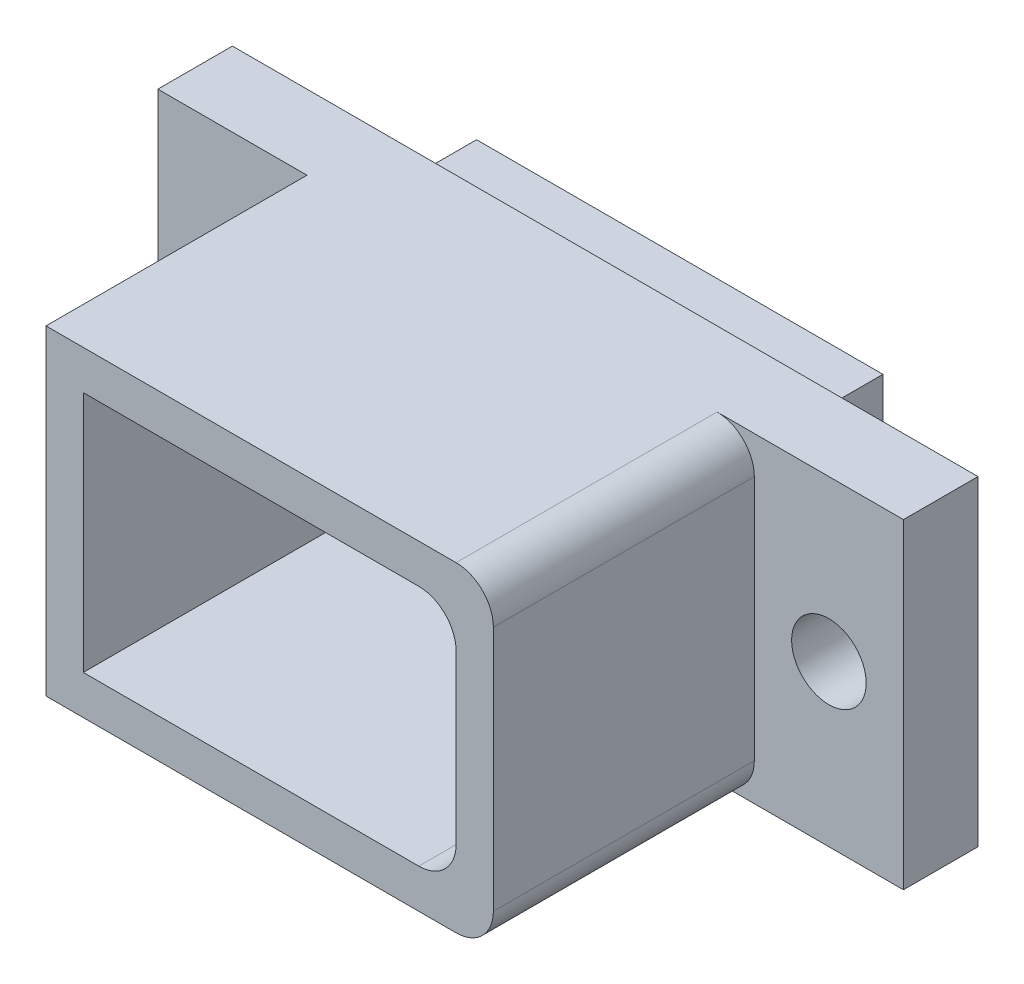
ISO-10303-21;
HEADER;
FILE_DESCRIPTION(('STEP AP214'),'2;1');
FILE_NAME('part.step','',(''),(''),'','','');
FILE_SCHEMA(('AUTOMOTIVE_DESIGN { 1 0 10303 214 1 1 1 1 }'));
ENDSEC;
DATA;
#1=APPLICATION_CONTEXT('core data for automotive mechanical design processes');
#2=APPLICATION_PROTOCOL_DEFINITION('international standard','automotive_design',2000,#1);
#3=PRODUCT_CONTEXT('',#1,'mechanical');
#4=PRODUCT('Part','Part','',(#3));
#5=PRODUCT_RELATED_PRODUCT_CATEGORY('part','',(#4));
#6=PRODUCT_DEFINITION_FORMATION('','',#4);
#7=PRODUCT_DEFINITION_CONTEXT('part definition',#1,'design');
#8=PRODUCT_DEFINITION('design','',#6,#7);
#9=PRODUCT_DEFINITION_SHAPE('','',#8);
#10=(LENGTH_UNIT() NAMED_UNIT(*) SI_UNIT(.MILLI.,.METRE.));
#11=(NAMED_UNIT(*) PLANE_ANGLE_UNIT() SI_UNIT($,.RADIAN.));
#12=(NAMED_UNIT(*) SI_UNIT($,.STERADIAN.) SOLID_ANGLE_UNIT());
#13=UNCERTAINTY_MEASURE_WITH_UNIT(LENGTH_MEASURE(1.E-05),#10,'distance_accuracy_value','');
#14=(GEOMETRIC_REPRESENTATION_CONTEXT(3) GLOBAL_UNCERTAINTY_ASSIGNED_CONTEXT((#13)) GLOBAL_UNIT_ASSIGNED_CONTEXT((#10,
#11,#12)) REPRESENTATION_CONTEXT('',''));
#15=CARTESIAN_POINT('',(0.,0.,0.));
#16=DIRECTION('',(0.,0.,1.));
#17=DIRECTION('',(1.,0.,0.));
#18=AXIS2_PLACEMENT_3D('',#15,#16,#17);
#19=CARTESIAN_POINT('',(0.,0.,4.));
#20=DIRECTION('',(0.,0.,1.));
#21=DIRECTION('',(1.,0.,0.));
#22=AXIS2_PLACEMENT_3D('',#19,#20,#21);
#23=PLANE('',#22);
#24=CARTESIAN_POINT('',(-8.,0.,4.));
#25=DIRECTION('',(0.,0.,1.));
#26=DIRECTION('',(1.,0.,0.));
#27=AXIS2_PLACEMENT_3D('',#24,#25,#26);
#28=CIRCLE('',#27,1.);
#29=CARTESIAN_POINT('',(-7.,0.,4.));
#30=VERTEX_POINT('',#29);
#31=EDGE_CURVE('E301',#30,#30,#28,.T.);
#32=ORIENTED_EDGE('',*,*,#31,.F.);
#33=EDGE_LOOP('',(#32));
#34=FACE_BOUND('',#33,.T.);
#35=DIRECTION('',(0.,-1.,0.));
#36=VECTOR('',#35,1.);
#37=CARTESIAN_POINT('',(-6.,0.,4.));
#38=LINE('',#37,#36);
#39=CARTESIAN_POINT('',(-6.,4.3,4.));
#40=VERTEX_POINT('',#39);
#41=CARTESIAN_POINT('',(-6.,-4.3,4.));
#42=VERTEX_POINT('',#41);
#43=EDGE_CURVE('E230',#40,#42,#38,.T.);
#44=ORIENTED_EDGE('',*,*,#43,.F.);
#45=DIRECTION('',(-1.,0.,0.));
#46=VECTOR('',#45,1.);
#47=CARTESIAN_POINT('',(-10.,4.3,4.));
#48=LINE('',#47,#46);
#49=CARTESIAN_POINT('',(-10.,4.3,4.));
#50=VERTEX_POINT('',#49);
#51=EDGE_CURVE('E310',#40,#50,#48,.T.);
#52=ORIENTED_EDGE('',*,*,#51,.T.);
#53=DIRECTION('',(0.,-1.,0.));
#54=VECTOR('',#53,1.);
#55=CARTESIAN_POINT('',(-10.,4.3,4.));
#56=LINE('',#55,#54);
#57=CARTESIAN_POINT('',(-10.,-4.3,4.));
#58=VERTEX_POINT('',#57);
#59=EDGE_CURVE('E314',#50,#58,#56,.T.);
#60=ORIENTED_EDGE('',*,*,#59,.T.);
#61=DIRECTION('',(1.,0.,0.));
#62=VECTOR('',#61,1.);
#63=CARTESIAN_POINT('',(-10.,-4.3,4.));
#64=LINE('',#63,#62);
#65=EDGE_CURVE('E317',#58,#42,#64,.T.);
#66=ORIENTED_EDGE('',*,*,#65,.T.);
#67=EDGE_LOOP('',(#44,#52,#60,#66));
#68=FACE_BOUND('',#67,.T.);
#69=ADVANCED_FACE('F42',(#34,#68),#23,.T.);
#70=CARTESIAN_POINT('',(-3.,1.5,4.));
#71=DIRECTION('',(0.,0.,1.));
#72=DIRECTION('',(1.,0.,0.));
#73=AXIS2_PLACEMENT_3D('',#70,#71,#72);
#74=CIRCLE('',#73,0.5);
#75=CARTESIAN_POINT('',(-2.5,1.5,4.));
#76=VERTEX_POINT('',#75);
#77=EDGE_CURVE('E266',#76,#76,#74,.T.);
#78=ORIENTED_EDGE('',*,*,#77,.F.);
#79=EDGE_LOOP('',(#78));
#80=FACE_BOUND('',#79,.T.);
#81=CARTESIAN_POINT('',(0.,1.5,4.));
#82=DIRECTION('',(0.,0.,1.));
#83=DIRECTION('',(1.,0.,0.));
#84=AXIS2_PLACEMENT_3D('',#81,#82,#83);
#85=CIRCLE('',#84,0.5);
#86=CARTESIAN_POINT('',(0.500000000000001,1.5,4.));
#87=VERTEX_POINT('',#86);
#88=EDGE_CURVE('E282',#87,#87,#85,.T.);
#89=ORIENTED_EDGE('',*,*,#88,.F.);
#90=EDGE_LOOP('',(#89));
#91=FACE_BOUND('',#90,.T.);
#92=CARTESIAN_POINT('',(3.00000000000003,-1.5,4.));
#93=DIRECTION('',(0.,0.,1.));
#94=DIRECTION('',(1.,0.,0.));
#95=AXIS2_PLACEMENT_3D('',#92,#93,#94);
#96=CIRCLE('',#95,0.5);
#97=CARTESIAN_POINT('',(3.50000000000003,-1.5,4.));
#98=VERTEX_POINT('',#97);
#99=EDGE_CURVE('E288',#98,#98,#96,.T.);
#100=ORIENTED_EDGE('',*,*,#99,.F.);
#101=EDGE_LOOP('',(#100));
#102=FACE_BOUND('',#101,.T.);
#103=CARTESIAN_POINT('',(3.,1.5,4.));
#104=DIRECTION('',(0.,0.,1.));
#105=DIRECTION('',(1.,0.,0.));
#106=AXIS2_PLACEMENT_3D('',#103,#104,#105);
#107=CIRCLE('',#106,0.5);
#108=CARTESIAN_POINT('',(3.5,1.5,4.));
#109=VERTEX_POINT('',#108);
#110=EDGE_CURVE('E291',#109,#109,#107,.T.);
#111=ORIENTED_EDGE('',*,*,#110,.F.);
#112=EDGE_LOOP('',(#111));
#113=FACE_BOUND('',#112,.T.);
#114=CARTESIAN_POINT('',(0.,-1.5,4.));
#115=DIRECTION('',(0.,0.,1.));
#116=DIRECTION('',(1.,0.,0.));
#117=AXIS2_PLACEMENT_3D('',#114,#115,#116);
#118=CIRCLE('',#117,0.5);
#119=CARTESIAN_POINT('',(0.500000000000032,-1.5,4.));
#120=VERTEX_POINT('',#119);
#121=EDGE_CURVE('E285',#120,#120,#118,.T.);
#122=ORIENTED_EDGE('',*,*,#121,.F.);
#123=EDGE_LOOP('',(#122));
#124=FACE_BOUND('',#123,.T.);
#125=CARTESIAN_POINT('',(-2.99999999999997,-1.5,4.));
#126=DIRECTION('',(0.,0.,1.));
#127=DIRECTION('',(1.,0.,0.));
#128=AXIS2_PLACEMENT_3D('',#125,#126,#127);
#129=CIRCLE('',#128,0.5);
#130=CARTESIAN_POINT('',(-2.49999999999997,-1.5,4.));
#131=VERTEX_POINT('',#130);
#132=EDGE_CURVE('E279',#131,#131,#129,.T.);
#133=ORIENTED_EDGE('',*,*,#132,.F.);
#134=EDGE_LOOP('',(#133));
#135=FACE_BOUND('',#134,.T.);
#136=DIRECTION('',(1.,0.,0.));
#137=VECTOR('',#136,1.);
#138=CARTESIAN_POINT('',(0.,3.25,4.));
#139=LINE('',#138,#137);
#140=CARTESIAN_POINT('',(-5.,3.25,4.));
#141=VERTEX_POINT('',#140);
#142=CARTESIAN_POINT('',(3.99999999999999,3.25,4.));
#143=VERTEX_POINT('',#142);
#144=EDGE_CURVE('E237',#141,#143,#139,.T.);
#145=ORIENTED_EDGE('',*,*,#144,.F.);
#146=DIRECTION('',(0.,-1.,0.));
#147=VECTOR('',#146,1.);
#148=CARTESIAN_POINT('',(-5.,0.,4.));
#149=LINE('',#148,#147);
#150=CARTESIAN_POINT('',(-5.,-3.25,4.));
#151=VERTEX_POINT('',#150);
#152=EDGE_CURVE('E201',#141,#151,#149,.T.);
#153=ORIENTED_EDGE('',*,*,#152,.T.);
#154=DIRECTION('',(1.,0.,0.));
#155=VECTOR('',#154,1.);
#156=CARTESIAN_POINT('',(0.,-3.25,4.));
#157=LINE('',#156,#155);
#158=CARTESIAN_POINT('',(4.,-3.25,4.));
#159=VERTEX_POINT('',#158);
#160=EDGE_CURVE('E203',#151,#159,#157,.T.);
#161=ORIENTED_EDGE('',*,*,#160,.T.);
#162=CARTESIAN_POINT('',(4.,-2.25,4.));
#163=DIRECTION('',(0.,0.,1.));
#164=DIRECTION('',(1.,0.,0.));
#165=AXIS2_PLACEMENT_3D('',#162,#163,#164);
#166=CIRCLE('',#165,1.);
#167=CARTESIAN_POINT('',(5.,-2.24999999999999,4.));
#168=VERTEX_POINT('',#167);
#169=EDGE_CURVE('E246',#159,#168,#166,.T.);
#170=ORIENTED_EDGE('',*,*,#169,.T.);
#171=DIRECTION('',(0.,-1.,0.));
#172=VECTOR('',#171,1.);
#173=CARTESIAN_POINT('',(5.,0.,4.));
#174=LINE('',#173,#172);
#175=CARTESIAN_POINT('',(5.,2.24999999999999,4.));
#176=VERTEX_POINT('',#175);
#177=EDGE_CURVE('E243',#176,#168,#174,.T.);
#178=ORIENTED_EDGE('',*,*,#177,.F.);
#179=CARTESIAN_POINT('',(4.,2.25,4.));
#180=DIRECTION('',(0.,0.,1.));
#181=DIRECTION('',(1.,0.,0.));
#182=AXIS2_PLACEMENT_3D('',#179,#180,#181);
#183=CIRCLE('',#182,0.999999999999999);
#184=EDGE_CURVE('E240',#143,#176,#183,.F.);
#185=ORIENTED_EDGE('',*,*,#184,.F.);
#186=EDGE_LOOP('',(#145,#153,#161,#170,#178,#185));
#187=FACE_BOUND('',#186,.T.);
#188=ADVANCED_FACE('F409',(#80,#91,#102,#113,#124,#135,#187),#23,.T.);
#189=CARTESIAN_POINT('',(0.,0.,0.));
#190=DIRECTION('',(0.,0.,1.));
#191=DIRECTION('',(1.,0.,0.));
#192=AXIS2_PLACEMENT_3D('',#189,#190,#191);
#193=PLANE('',#192);
#194=DIRECTION('',(0.,1.,0.));
#195=VECTOR('',#194,1.);
#196=CARTESIAN_POINT('',(5.45,3.4,0.));
#197=LINE('',#196,#195);
#198=CARTESIAN_POINT('',(5.45,-3.4,0.));
#199=VERTEX_POINT('',#198);
#200=CARTESIAN_POINT('',(5.45,3.4,0.));
#201=VERTEX_POINT('',#200);
#202=EDGE_CURVE('E356',#199,#201,#197,.T.);
#203=ORIENTED_EDGE('',*,*,#202,.F.);
#204=DIRECTION('',(1.,0.,0.));
#205=VECTOR('',#204,1.);
#206=CARTESIAN_POINT('',(-5.45,-3.4,0.));
#207=LINE('',#206,#205);
#208=CARTESIAN_POINT('',(-5.45,-3.4,0.));
#209=VERTEX_POINT('',#208);
#210=EDGE_CURVE('E361',#209,#199,#207,.T.);
#211=ORIENTED_EDGE('',*,*,#210,.F.);
#212=DIRECTION('',(0.,-1.,0.));
#213=VECTOR('',#212,1.);
#214=CARTESIAN_POINT('',(-5.45,3.4,0.));
#215=LINE('',#214,#213);
#216=CARTESIAN_POINT('',(-5.45,3.4,0.));
#217=VERTEX_POINT('',#216);
#218=EDGE_CURVE('E375',#217,#209,#215,.T.);
#219=ORIENTED_EDGE('',*,*,#218,.F.);
#220=DIRECTION('',(-1.,0.,0.));
#221=VECTOR('',#220,1.);
#222=CARTESIAN_POINT('',(-5.45,3.4,0.));
#223=LINE('',#222,#221);
#224=EDGE_CURVE('E373',#201,#217,#223,.T.);
#225=ORIENTED_EDGE('',*,*,#224,.F.);
#226=EDGE_LOOP('',(#203,#211,#219,#225));
#227=FACE_BOUND('',#226,.T.);
#228=CARTESIAN_POINT('',(-3.,1.5,0.));
#229=DIRECTION('',(0.,0.,1.));
#230=DIRECTION('',(1.,0.,0.));
#231=AXIS2_PLACEMENT_3D('',#228,#229,#230);
#232=CIRCLE('',#231,0.5);
#233=CARTESIAN_POINT('',(-2.5,1.5,0.));
#234=VERTEX_POINT('',#233);
#235=EDGE_CURVE('E353',#234,#234,#232,.T.);
#236=ORIENTED_EDGE('',*,*,#235,.T.);
#237=EDGE_LOOP('',(#236));
#238=FACE_BOUND('',#237,.T.);
#239=CARTESIAN_POINT('',(0.,1.5,0.));
#240=DIRECTION('',(0.,0.,1.));
#241=DIRECTION('',(1.,0.,0.));
#242=AXIS2_PLACEMENT_3D('',#239,#240,#241);
#243=CIRCLE('',#242,0.5);
#244=CARTESIAN_POINT('',(0.500000000000001,1.5,0.));
#245=VERTEX_POINT('',#244);
#246=EDGE_CURVE('E350',#245,#245,#243,.T.);
#247=ORIENTED_EDGE('',*,*,#246,.T.);
#248=EDGE_LOOP('',(#247));
#249=FACE_BOUND('',#248,.T.);
#250=CARTESIAN_POINT('',(3.,1.5,0.));
#251=DIRECTION('',(0.,0.,1.));
#252=DIRECTION('',(1.,0.,0.));
#253=AXIS2_PLACEMENT_3D('',#250,#251,#252);
#254=CIRCLE('',#253,0.5);
#255=CARTESIAN_POINT('',(3.5,1.5,0.));
#256=VERTEX_POINT('',#255);
#257=EDGE_CURVE('E347',#256,#256,#254,.T.);
#258=ORIENTED_EDGE('',*,*,#257,.T.);
#259=EDGE_LOOP('',(#258));
#260=FACE_BOUND('',#259,.T.);
#261=CARTESIAN_POINT('',(0.,-1.5,0.));
#262=DIRECTION('',(0.,0.,1.));
#263=DIRECTION('',(1.,0.,0.));
#264=AXIS2_PLACEMENT_3D('',#261,#262,#263);
#265=CIRCLE('',#264,0.5);
#266=CARTESIAN_POINT('',(0.500000000000032,-1.5,0.));
#267=VERTEX_POINT('',#266);
#268=EDGE_CURVE('E344',#267,#267,#265,.T.);
#269=ORIENTED_EDGE('',*,*,#268,.T.);
#270=EDGE_LOOP('',(#269));
#271=FACE_BOUND('',#270,.T.);
#272=CARTESIAN_POINT('',(3.00000000000003,-1.5,0.));
#273=DIRECTION('',(0.,0.,1.));
#274=DIRECTION('',(1.,0.,0.));
#275=AXIS2_PLACEMENT_3D('',#272,#273,#274);
#276=CIRCLE('',#275,0.5);
#277=CARTESIAN_POINT('',(3.50000000000003,-1.5,0.));
#278=VERTEX_POINT('',#277);
#279=EDGE_CURVE('E341',#278,#278,#276,.T.);
#280=ORIENTED_EDGE('',*,*,#279,.T.);
#281=EDGE_LOOP('',(#280));
#282=FACE_BOUND('',#281,.T.);
#283=CARTESIAN_POINT('',(-2.99999999999997,-1.5,0.));
#284=DIRECTION('',(0.,0.,1.));
#285=DIRECTION('',(1.,0.,0.));
#286=AXIS2_PLACEMENT_3D('',#283,#284,#285);
#287=CIRCLE('',#286,0.5);
#288=CARTESIAN_POINT('',(-2.49999999999997,-1.5,0.));
#289=VERTEX_POINT('',#288);
#290=EDGE_CURVE('E338',#289,#289,#287,.T.);
#291=ORIENTED_EDGE('',*,*,#290,.T.);
#292=EDGE_LOOP('',(#291));
#293=FACE_BOUND('',#292,.T.);
#294=ADVANCED_FACE('F391',(#227,#238,#249,#260,#271,#282,#293),#193,.F.);
#295=CARTESIAN_POINT('',(5.45,3.4,2.));
#296=DIRECTION('',(-1.,0.,0.));
#297=DIRECTION('',(0.,-1.,0.));
#298=AXIS2_PLACEMENT_3D('',#295,#296,#297);
#299=PLANE('',#298);
#300=ORIENTED_EDGE('',*,*,#202,.T.);
#301=DIRECTION('',(0.,0.,-1.));
#302=VECTOR('',#301,1.);
#303=CARTESIAN_POINT('',(5.45,3.4,2.));
#304=LINE('',#303,#302);
#305=CARTESIAN_POINT('',(5.45,3.4,2.));
#306=VERTEX_POINT('',#305);
#307=EDGE_CURVE('E11',#306,#201,#304,.T.);
#308=ORIENTED_EDGE('',*,*,#307,.F.);
#309=DIRECTION('',(0.,1.,0.));
#310=VECTOR('',#309,1.);
#311=CARTESIAN_POINT('',(5.45,3.4,2.));
#312=LINE('',#311,#310);
#313=CARTESIAN_POINT('',(5.45,-3.4,2.));
#314=VERTEX_POINT('',#313);
#315=EDGE_CURVE('E357',#314,#306,#312,.T.);
#316=ORIENTED_EDGE('',*,*,#315,.F.);
#317=DIRECTION('',(0.,0.,-1.));
#318=VECTOR('',#317,1.);
#319=CARTESIAN_POINT('',(5.45,-3.4,2.));
#320=LINE('',#319,#318);
#321=EDGE_CURVE('E370',#314,#199,#320,.T.);
#322=ORIENTED_EDGE('',*,*,#321,.T.);
#323=EDGE_LOOP('',(#300,#308,#316,#322));
#324=FACE_BOUND('',#323,.T.);
#325=ADVANCED_FACE('F44',(#324),#299,.F.);
#326=CARTESIAN_POINT('',(-5.45,3.4,2.));
#327=DIRECTION('',(0.,-1.,0.));
#328=DIRECTION('',(0.,0.,-1.));
#329=AXIS2_PLACEMENT_3D('',#326,#327,#328);
#330=PLANE('',#329);
#331=ORIENTED_EDGE('',*,*,#224,.T.);
#332=DIRECTION('',(0.,0.,-1.));
#333=VECTOR('',#332,1.);
#334=CARTESIAN_POINT('',(-5.45,3.4,2.));
#335=LINE('',#334,#333);
#336=CARTESIAN_POINT('',(-5.45,3.4,2.));
#337=VERTEX_POINT('',#336);
#338=EDGE_CURVE('E50',#337,#217,#335,.T.);
#339=ORIENTED_EDGE('',*,*,#338,.F.);
#340=DIRECTION('',(-1.,0.,0.));
#341=VECTOR('',#340,1.);
#342=CARTESIAN_POINT('',(-5.45,3.4,2.));
#343=LINE('',#342,#341);
#344=EDGE_CURVE('E360',#306,#337,#343,.T.);
#345=ORIENTED_EDGE('',*,*,#344,.F.);
#346=ORIENTED_EDGE('',*,*,#307,.T.);
#347=EDGE_LOOP('',(#331,#339,#345,#346));
#348=FACE_BOUND('',#347,.T.);
#349=ADVANCED_FACE('F401',(#348),#330,.F.);
#350=CARTESIAN_POINT('',(-5.45,3.4,2.));
#351=DIRECTION('',(1.,0.,0.));
#352=DIRECTION('',(0.,1.,0.));
#353=AXIS2_PLACEMENT_3D('',#350,#351,#352);
#354=PLANE('',#353);
#355=ORIENTED_EDGE('',*,*,#218,.T.);
#356=DIRECTION('',(0.,0.,-1.));
#357=VECTOR('',#356,1.);
#358=CARTESIAN_POINT('',(-5.45,-3.4,2.));
#359=LINE('',#358,#357);
#360=CARTESIAN_POINT('',(-5.45,-3.4,2.));
#361=VERTEX_POINT('',#360);
#362=EDGE_CURVE('E380',#361,#209,#359,.T.);
#363=ORIENTED_EDGE('',*,*,#362,.F.);
#364=DIRECTION('',(0.,-1.,0.));
#365=VECTOR('',#364,1.);
#366=CARTESIAN_POINT('',(-5.45,3.4,2.));
#367=LINE('',#366,#365);
#368=EDGE_CURVE('E364',#337,#361,#367,.T.);
#369=ORIENTED_EDGE('',*,*,#368,.F.);
#370=ORIENTED_EDGE('',*,*,#338,.T.);
#371=EDGE_LOOP('',(#355,#363,#369,#370));
#372=FACE_BOUND('',#371,.T.);
#373=ADVANCED_FACE('F386',(#372),#354,.F.);
#374=CARTESIAN_POINT('',(-5.45,-3.4,2.));
#375=DIRECTION('',(0.,1.,0.));
#376=DIRECTION('',(0.,0.,1.));
#377=AXIS2_PLACEMENT_3D('',#374,#375,#376);
#378=PLANE('',#377);
#379=ORIENTED_EDGE('',*,*,#210,.T.);
#380=ORIENTED_EDGE('',*,*,#321,.F.);
#381=DIRECTION('',(1.,0.,0.));
#382=VECTOR('',#381,1.);
#383=CARTESIAN_POINT('',(-5.45,-3.4,2.));
#384=LINE('',#383,#382);
#385=EDGE_CURVE('E367',#361,#314,#384,.T.);
#386=ORIENTED_EDGE('',*,*,#385,.F.);
#387=ORIENTED_EDGE('',*,*,#362,.T.);
#388=EDGE_LOOP('',(#379,#380,#386,#387));
#389=FACE_BOUND('',#388,.T.);
#390=ADVANCED_FACE('F395',(#389),#378,.F.);
#391=CARTESIAN_POINT('',(-3.,1.5,2.));
#392=DIRECTION('',(0.,0.,-1.));
#393=DIRECTION('',(-1.,0.,0.));
#394=AXIS2_PLACEMENT_3D('',#391,#392,#393);
#395=CYLINDRICAL_SURFACE('',#394,0.5);
#396=ORIENTED_EDGE('',*,*,#235,.F.);
#397=EDGE_LOOP('',(#396));
#398=FACE_BOUND('',#397,.T.);
#399=ORIENTED_EDGE('',*,*,#77,.T.);
#400=EDGE_LOOP('',(#399));
#401=FACE_BOUND('',#400,.T.);
#402=ADVANCED_FACE('F512',(#398,#401),#395,.F.);
#403=CARTESIAN_POINT('',(0.,1.5,2.));
#404=DIRECTION('',(0.,0.,-1.));
#405=DIRECTION('',(-1.,0.,0.));
#406=AXIS2_PLACEMENT_3D('',#403,#404,#405);
#407=CYLINDRICAL_SURFACE('',#406,0.5);
#408=ORIENTED_EDGE('',*,*,#246,.F.);
#409=EDGE_LOOP('',(#408));
#410=FACE_BOUND('',#409,.T.);
#411=ORIENTED_EDGE('',*,*,#88,.T.);
#412=EDGE_LOOP('',(#411));
#413=FACE_BOUND('',#412,.T.);
#414=ADVANCED_FACE('F508',(#410,#413),#407,.F.);
#415=CARTESIAN_POINT('',(3.,1.5,2.));
#416=DIRECTION('',(0.,0.,-1.));
#417=DIRECTION('',(-1.,0.,0.));
#418=AXIS2_PLACEMENT_3D('',#415,#416,#417);
#419=CYLINDRICAL_SURFACE('',#418,0.5);
#420=ORIENTED_EDGE('',*,*,#257,.F.);
#421=EDGE_LOOP('',(#420));
#422=FACE_BOUND('',#421,.T.);
#423=ORIENTED_EDGE('',*,*,#110,.T.);
#424=EDGE_LOOP('',(#423));
#425=FACE_BOUND('',#424,.T.);
#426=ADVANCED_FACE('F504',(#422,#425),#419,.F.);
#427=CARTESIAN_POINT('',(0.,-1.5,2.));
#428=DIRECTION('',(0.,0.,-1.));
#429=DIRECTION('',(-1.,0.,0.));
#430=AXIS2_PLACEMENT_3D('',#427,#428,#429);
#431=CYLINDRICAL_SURFACE('',#430,0.5);
#432=ORIENTED_EDGE('',*,*,#268,.F.);
#433=EDGE_LOOP('',(#432));
#434=FACE_BOUND('',#433,.T.);
#435=ORIENTED_EDGE('',*,*,#121,.T.);
#436=EDGE_LOOP('',(#435));
#437=FACE_BOUND('',#436,.T.);
#438=ADVANCED_FACE('F500',(#434,#437),#431,.F.);
#439=CARTESIAN_POINT('',(3.00000000000003,-1.5,2.));
#440=DIRECTION('',(0.,0.,-1.));
#441=DIRECTION('',(-1.,0.,0.));
#442=AXIS2_PLACEMENT_3D('',#439,#440,#441);
#443=CYLINDRICAL_SURFACE('',#442,0.5);
#444=ORIENTED_EDGE('',*,*,#279,.F.);
#445=EDGE_LOOP('',(#444));
#446=FACE_BOUND('',#445,.T.);
#447=ORIENTED_EDGE('',*,*,#99,.T.);
#448=EDGE_LOOP('',(#447));
#449=FACE_BOUND('',#448,.T.);
#450=ADVANCED_FACE('F496',(#446,#449),#443,.F.);
#451=CARTESIAN_POINT('',(-2.99999999999997,-1.5,2.));
#452=DIRECTION('',(0.,0.,-1.));
#453=DIRECTION('',(-1.,0.,0.));
#454=AXIS2_PLACEMENT_3D('',#451,#452,#453);
#455=CYLINDRICAL_SURFACE('',#454,0.5);
#456=ORIENTED_EDGE('',*,*,#290,.F.);
#457=EDGE_LOOP('',(#456));
#458=FACE_BOUND('',#457,.T.);
#459=ORIENTED_EDGE('',*,*,#132,.T.);
#460=EDGE_LOOP('',(#459));
#461=FACE_BOUND('',#460,.T.);
#462=ADVANCED_FACE('F431',(#458,#461),#455,.F.);
#463=CARTESIAN_POINT('',(0.,0.,2.));
#464=DIRECTION('',(0.,0.,1.));
#465=DIRECTION('',(1.,0.,0.));
#466=AXIS2_PLACEMENT_3D('',#463,#464,#465);
#467=PLANE('',#466);
#468=CARTESIAN_POINT('',(7.99999999999999,0.,2.));
#469=DIRECTION('',(0.,0.,1.));
#470=DIRECTION('',(-1.,0.,0.));
#471=AXIS2_PLACEMENT_3D('',#468,#469,#470);
#472=CIRCLE('',#471,1.);
#473=CARTESIAN_POINT('',(6.99999999999999,0.,2.));
#474=VERTEX_POINT('',#473);
#475=EDGE_CURVE('E294',#474,#474,#472,.T.);
#476=ORIENTED_EDGE('',*,*,#475,.T.);
#477=EDGE_LOOP('',(#476));
#478=FACE_BOUND('',#477,.T.);
#479=CARTESIAN_POINT('',(-8.,0.,2.));
#480=DIRECTION('',(0.,0.,1.));
#481=DIRECTION('',(1.,0.,0.));
#482=AXIS2_PLACEMENT_3D('',#479,#480,#481);
#483=CIRCLE('',#482,1.);
#484=CARTESIAN_POINT('',(-7.,0.,2.));
#485=VERTEX_POINT('',#484);
#486=EDGE_CURVE('E298',#485,#485,#483,.T.);
#487=ORIENTED_EDGE('',*,*,#486,.T.);
#488=EDGE_LOOP('',(#487));
#489=FACE_BOUND('',#488,.T.);
#490=DIRECTION('',(0.,1.,0.));
#491=VECTOR('',#490,1.);
#492=CARTESIAN_POINT('',(10.,4.3,2.));
#493=LINE('',#492,#491);
#494=CARTESIAN_POINT('',(10.,-4.3,2.));
#495=VERTEX_POINT('',#494);
#496=CARTESIAN_POINT('',(10.,4.3,2.));
#497=VERTEX_POINT('',#496);
#498=EDGE_CURVE('E304',#495,#497,#493,.T.);
#499=ORIENTED_EDGE('',*,*,#498,.F.);
#500=DIRECTION('',(1.,0.,0.));
#501=VECTOR('',#500,1.);
#502=CARTESIAN_POINT('',(-10.,-4.3,2.));
#503=LINE('',#502,#501);
#504=CARTESIAN_POINT('',(-10.,-4.3,2.));
#505=VERTEX_POINT('',#504);
#506=EDGE_CURVE('E311',#505,#495,#503,.T.);
#507=ORIENTED_EDGE('',*,*,#506,.F.);
#508=DIRECTION('',(0.,-1.,0.));
#509=VECTOR('',#508,1.);
#510=CARTESIAN_POINT('',(-10.,4.3,2.));
#511=LINE('',#510,#509);
#512=CARTESIAN_POINT('',(-10.,4.3,2.));
#513=VERTEX_POINT('',#512);
#514=EDGE_CURVE('E324',#513,#505,#511,.T.);
#515=ORIENTED_EDGE('',*,*,#514,.F.);
#516=DIRECTION('',(-1.,0.,0.));
#517=VECTOR('',#516,1.);
#518=CARTESIAN_POINT('',(-10.,4.3,2.));
#519=LINE('',#518,#517);
#520=EDGE_CURVE('E322',#497,#513,#519,.T.);
#521=ORIENTED_EDGE('',*,*,#520,.F.);
#522=EDGE_LOOP('',(#499,#507,#515,#521));
#523=FACE_BOUND('',#522,.T.);
#524=ORIENTED_EDGE('',*,*,#385,.T.);
#525=ORIENTED_EDGE('',*,*,#315,.T.);
#526=ORIENTED_EDGE('',*,*,#344,.T.);
#527=ORIENTED_EDGE('',*,*,#368,.T.);
#528=EDGE_LOOP('',(#524,#525,#526,#527));
#529=FACE_BOUND('',#528,.T.);
#530=ADVANCED_FACE('F400',(#478,#489,#523,#529),#467,.F.);
#531=CARTESIAN_POINT('',(10.,4.3,4.));
#532=VERTEX_POINT('',#531);
#533=CARTESIAN_POINT('',(5.,4.3,4.));
#534=VERTEX_POINT('',#533);
#535=EDGE_CURVE('E312',#532,#534,#48,.T.);
#536=ORIENTED_EDGE('',*,*,#535,.T.);
#537=CARTESIAN_POINT('',(5.,3.3,4.));
#538=DIRECTION('',(0.,0.,1.));
#539=DIRECTION('',(1.,0.,0.));
#540=AXIS2_PLACEMENT_3D('',#537,#538,#539);
#541=CIRCLE('',#540,1.);
#542=CARTESIAN_POINT('',(6.,3.29999999999999,4.));
#543=VERTEX_POINT('',#542);
#544=EDGE_CURVE('E57',#534,#543,#541,.F.);
#545=ORIENTED_EDGE('',*,*,#544,.T.);
#546=DIRECTION('',(0.,-1.,0.));
#547=VECTOR('',#546,1.);
#548=CARTESIAN_POINT('',(6.,0.,4.));
#549=LINE('',#548,#547);
#550=CARTESIAN_POINT('',(6.,-3.29999999999999,4.));
#551=VERTEX_POINT('',#550);
#552=EDGE_CURVE('E62',#543,#551,#549,.T.);
#553=ORIENTED_EDGE('',*,*,#552,.T.);
#554=CARTESIAN_POINT('',(5.,-3.3,4.));
#555=DIRECTION('',(0.,0.,1.));
#556=DIRECTION('',(1.,0.,0.));
#557=AXIS2_PLACEMENT_3D('',#554,#555,#556);
#558=CIRCLE('',#557,1.);
#559=CARTESIAN_POINT('',(5.,-4.3,4.));
#560=VERTEX_POINT('',#559);
#561=EDGE_CURVE('E233',#560,#551,#558,.T.);
#562=ORIENTED_EDGE('',*,*,#561,.F.);
#563=CARTESIAN_POINT('',(10.,-4.3,4.));
#564=VERTEX_POINT('',#563);
#565=EDGE_CURVE('E316',#560,#564,#64,.T.);
#566=ORIENTED_EDGE('',*,*,#565,.T.);
#567=DIRECTION('',(0.,1.,0.));
#568=VECTOR('',#567,1.);
#569=CARTESIAN_POINT('',(10.,4.3,4.));
#570=LINE('',#569,#568);
#571=EDGE_CURVE('E307',#564,#532,#570,.T.);
#572=ORIENTED_EDGE('',*,*,#571,.T.);
#573=EDGE_LOOP('',(#536,#545,#553,#562,#566,#572));
#574=FACE_BOUND('',#573,.T.);
#575=CARTESIAN_POINT('',(7.99999999999999,0.,4.));
#576=DIRECTION('',(0.,0.,1.));
#577=DIRECTION('',(-1.,0.,0.));
#578=AXIS2_PLACEMENT_3D('',#575,#576,#577);
#579=CIRCLE('',#578,1.);
#580=CARTESIAN_POINT('',(6.99999999999999,0.,4.));
#581=VERTEX_POINT('',#580);
#582=EDGE_CURVE('E295',#581,#581,#579,.T.);
#583=ORIENTED_EDGE('',*,*,#582,.F.);
#584=EDGE_LOOP('',(#583));
#585=FACE_BOUND('',#584,.T.);
#586=ADVANCED_FACE('F412',(#574,#585),#23,.T.);
#587=CARTESIAN_POINT('',(10.,4.3,4.));
#588=DIRECTION('',(-1.,0.,0.));
#589=DIRECTION('',(0.,0.,1.));
#590=AXIS2_PLACEMENT_3D('',#587,#588,#589);
#591=PLANE('',#590);
#592=ORIENTED_EDGE('',*,*,#498,.T.);
#593=DIRECTION('',(0.,0.,-1.));
#594=VECTOR('',#593,1.);
#595=CARTESIAN_POINT('',(10.,4.3,4.));
#596=LINE('',#595,#594);
#597=EDGE_CURVE('E335',#532,#497,#596,.T.);
#598=ORIENTED_EDGE('',*,*,#597,.F.);
#599=ORIENTED_EDGE('',*,*,#571,.F.);
#600=DIRECTION('',(0.,0.,-1.));
#601=VECTOR('',#600,1.);
#602=CARTESIAN_POINT('',(10.,-4.3,4.));
#603=LINE('',#602,#601);
#604=EDGE_CURVE('E319',#564,#495,#603,.T.);
#605=ORIENTED_EDGE('',*,*,#604,.T.);
#606=EDGE_LOOP('',(#592,#598,#599,#605));
#607=FACE_BOUND('',#606,.T.);
#608=ADVANCED_FACE('F423',(#607),#591,.F.);
#609=CARTESIAN_POINT('',(-10.,4.3,4.));
#610=DIRECTION('',(0.,-1.,0.));
#611=DIRECTION('',(0.,0.,-1.));
#612=AXIS2_PLACEMENT_3D('',#609,#610,#611);
#613=PLANE('',#612);
#614=ORIENTED_EDGE('',*,*,#520,.T.);
#615=DIRECTION('',(0.,0.,-1.));
#616=VECTOR('',#615,1.);
#617=CARTESIAN_POINT('',(-10.,4.3,4.));
#618=LINE('',#617,#616);
#619=EDGE_CURVE('E332',#50,#513,#618,.T.);
#620=ORIENTED_EDGE('',*,*,#619,.F.);
#621=ORIENTED_EDGE('',*,*,#51,.F.);
#622=DIRECTION('',(0.,0.,-1.));
#623=VECTOR('',#622,1.);
#624=CARTESIAN_POINT('',(-6.,4.3,11.));
#625=LINE('',#624,#623);
#626=CARTESIAN_POINT('',(-6.,4.3,11.));
#627=VERTEX_POINT('',#626);
#628=EDGE_CURVE('E186',#627,#40,#625,.T.);
#629=ORIENTED_EDGE('',*,*,#628,.F.);
#630=DIRECTION('',(-1.,0.,0.));
#631=VECTOR('',#630,1.);
#632=CARTESIAN_POINT('',(0.,4.3,11.));
#633=LINE('',#632,#631);
#634=CARTESIAN_POINT('',(4.99999999999999,4.3,11.));
#635=VERTEX_POINT('',#634);
#636=EDGE_CURVE('E189',#635,#627,#633,.T.);
#637=ORIENTED_EDGE('',*,*,#636,.F.);
#638=DIRECTION('',(0.,0.,-1.));
#639=VECTOR('',#638,1.);
#640=CARTESIAN_POINT('',(4.99999999999999,4.3,11.));
#641=LINE('',#640,#639);
#642=EDGE_CURVE('E178',#635,#534,#641,.T.);
#643=ORIENTED_EDGE('',*,*,#642,.T.);
#644=ORIENTED_EDGE('',*,*,#535,.F.);
#645=ORIENTED_EDGE('',*,*,#597,.T.);
#646=EDGE_LOOP('',(#614,#620,#621,#629,#637,#643,#644,#645));
#647=FACE_BOUND('',#646,.T.);
#648=ADVANCED_FACE('F190',(#647),#613,.F.);
#649=CARTESIAN_POINT('',(-10.,4.3,4.));
#650=DIRECTION('',(1.,0.,0.));
#651=DIRECTION('',(0.,0.,-1.));
#652=AXIS2_PLACEMENT_3D('',#649,#650,#651);
#653=PLANE('',#652);
#654=ORIENTED_EDGE('',*,*,#514,.T.);
#655=DIRECTION('',(0.,0.,-1.));
#656=VECTOR('',#655,1.);
#657=CARTESIAN_POINT('',(-10.,-4.3,4.));
#658=LINE('',#657,#656);
#659=EDGE_CURVE('E329',#58,#505,#658,.T.);
#660=ORIENTED_EDGE('',*,*,#659,.F.);
#661=ORIENTED_EDGE('',*,*,#59,.F.);
#662=ORIENTED_EDGE('',*,*,#619,.T.);
#663=EDGE_LOOP('',(#654,#660,#661,#662));
#664=FACE_BOUND('',#663,.T.);
#665=ADVANCED_FACE('F459',(#664),#653,.F.);
#666=CARTESIAN_POINT('',(-10.,-4.3,4.));
#667=DIRECTION('',(0.,1.,0.));
#668=DIRECTION('',(0.,0.,1.));
#669=AXIS2_PLACEMENT_3D('',#666,#667,#668);
#670=PLANE('',#669);
#671=ORIENTED_EDGE('',*,*,#506,.T.);
#672=ORIENTED_EDGE('',*,*,#604,.F.);
#673=ORIENTED_EDGE('',*,*,#565,.F.);
#674=DIRECTION('',(0.,0.,-1.));
#675=VECTOR('',#674,1.);
#676=CARTESIAN_POINT('',(4.99999999999999,-4.3,11.));
#677=LINE('',#676,#675);
#678=CARTESIAN_POINT('',(4.99999999999999,-4.3,11.));
#679=VERTEX_POINT('',#678);
#680=EDGE_CURVE('E270',#679,#560,#677,.T.);
#681=ORIENTED_EDGE('',*,*,#680,.F.);
#682=DIRECTION('',(1.,0.,0.));
#683=VECTOR('',#682,1.);
#684=CARTESIAN_POINT('',(0.,-4.3,11.));
#685=LINE('',#684,#683);
#686=CARTESIAN_POINT('',(-6.,-4.3,11.));
#687=VERTEX_POINT('',#686);
#688=EDGE_CURVE('E207',#687,#679,#685,.T.);
#689=ORIENTED_EDGE('',*,*,#688,.F.);
#690=DIRECTION('',(0.,0.,-1.));
#691=VECTOR('',#690,1.);
#692=CARTESIAN_POINT('',(-6.,-4.3,11.));
#693=LINE('',#692,#691);
#694=EDGE_CURVE('E273',#687,#42,#693,.T.);
#695=ORIENTED_EDGE('',*,*,#694,.T.);
#696=ORIENTED_EDGE('',*,*,#65,.F.);
#697=ORIENTED_EDGE('',*,*,#659,.T.);
#698=EDGE_LOOP('',(#671,#672,#673,#681,#689,#695,#696,#697));
#699=FACE_BOUND('',#698,.T.);
#700=ADVANCED_FACE('F453',(#699),#670,.F.);
#701=CARTESIAN_POINT('',(-8.,0.,4.));
#702=DIRECTION('',(0.,0.,-1.));
#703=DIRECTION('',(-1.,0.,0.));
#704=AXIS2_PLACEMENT_3D('',#701,#702,#703);
#705=CYLINDRICAL_SURFACE('',#704,1.);
#706=ORIENTED_EDGE('',*,*,#31,.T.);
#707=EDGE_LOOP('',(#706));
#708=FACE_BOUND('',#707,.T.);
#709=ORIENTED_EDGE('',*,*,#486,.F.);
#710=EDGE_LOOP('',(#709));
#711=FACE_BOUND('',#710,.T.);
#712=ADVANCED_FACE('F439',(#708,#711),#705,.F.);
#713=CARTESIAN_POINT('',(7.99999999999999,0.,4.));
#714=DIRECTION('',(0.,0.,-1.));
#715=DIRECTION('',(-1.,0.,0.));
#716=AXIS2_PLACEMENT_3D('',#713,#714,#715);
#717=CYLINDRICAL_SURFACE('',#716,1.);
#718=ORIENTED_EDGE('',*,*,#582,.T.);
#719=EDGE_LOOP('',(#718));
#720=FACE_BOUND('',#719,.T.);
#721=ORIENTED_EDGE('',*,*,#475,.F.);
#722=EDGE_LOOP('',(#721));
#723=FACE_BOUND('',#722,.T.);
#724=ADVANCED_FACE('F436',(#720,#723),#717,.F.);
#725=CARTESIAN_POINT('',(0.,3.25,11.));
#726=DIRECTION('',(0.,1.,0.));
#727=DIRECTION('',(0.,0.,1.));
#728=AXIS2_PLACEMENT_3D('',#725,#726,#727);
#729=PLANE('',#728);
#730=ORIENTED_EDGE('',*,*,#144,.T.);
#731=DIRECTION('',(0.,0.,-1.));
#732=VECTOR('',#731,1.);
#733=CARTESIAN_POINT('',(3.99999999999999,3.25,11.));
#734=LINE('',#733,#732);
#735=CARTESIAN_POINT('',(3.99999999999999,3.25,11.));
#736=VERTEX_POINT('',#735);
#737=EDGE_CURVE('E263',#736,#143,#734,.T.);
#738=ORIENTED_EDGE('',*,*,#737,.F.);
#739=DIRECTION('',(1.,0.,0.));
#740=VECTOR('',#739,1.);
#741=CARTESIAN_POINT('',(0.,3.25,11.));
#742=LINE('',#741,#740);
#743=CARTESIAN_POINT('',(-5.,3.25,11.));
#744=VERTEX_POINT('',#743);
#745=EDGE_CURVE('E212',#744,#736,#742,.T.);
#746=ORIENTED_EDGE('',*,*,#745,.F.);
#747=DIRECTION('',(0.,0.,-1.));
#748=VECTOR('',#747,1.);
#749=CARTESIAN_POINT('',(-5.,3.25,11.));
#750=LINE('',#749,#748);
#751=EDGE_CURVE('E185',#744,#141,#750,.T.);
#752=ORIENTED_EDGE('',*,*,#751,.T.);
#753=EDGE_LOOP('',(#730,#738,#746,#752));
#754=FACE_BOUND('',#753,.T.);
#755=ADVANCED_FACE('F438',(#754),#729,.F.);
#756=CARTESIAN_POINT('',(4.,2.25,11.));
#757=DIRECTION('',(0.,0.,-1.));
#758=DIRECTION('',(-1.,0.,0.));
#759=AXIS2_PLACEMENT_3D('',#756,#757,#758);
#760=CYLINDRICAL_SURFACE('',#759,0.999999999999999);
#761=ORIENTED_EDGE('',*,*,#184,.T.);
#762=DIRECTION('',(0.,0.,-1.));
#763=VECTOR('',#762,1.);
#764=CARTESIAN_POINT('',(5.,2.24999999999999,11.));
#765=LINE('',#764,#763);
#766=CARTESIAN_POINT('',(5.,2.24999999999999,11.));
#767=VERTEX_POINT('',#766);
#768=EDGE_CURVE('E260',#767,#176,#765,.T.);
#769=ORIENTED_EDGE('',*,*,#768,.F.);
#770=CARTESIAN_POINT('',(4.,2.25,11.));
#771=DIRECTION('',(0.,0.,1.));
#772=DIRECTION('',(1.,0.,0.));
#773=AXIS2_PLACEMENT_3D('',#770,#771,#772);
#774=CIRCLE('',#773,0.999999999999999);
#775=EDGE_CURVE('E215',#736,#767,#774,.F.);
#776=ORIENTED_EDGE('',*,*,#775,.F.);
#777=ORIENTED_EDGE('',*,*,#737,.T.);
#778=EDGE_LOOP('',(#761,#769,#776,#777));
#779=FACE_BOUND('',#778,.T.);
#780=ADVANCED_FACE('F615',(#779),#760,.F.);
#781=CARTESIAN_POINT('',(5.,0.,11.));
#782=DIRECTION('',(1.,0.,0.));
#783=DIRECTION('',(0.,1.,0.));
#784=AXIS2_PLACEMENT_3D('',#781,#782,#783);
#785=PLANE('',#784);
#786=ORIENTED_EDGE('',*,*,#177,.T.);
#787=DIRECTION('',(0.,0.,-1.));
#788=VECTOR('',#787,1.);
#789=CARTESIAN_POINT('',(5.,-2.24999999999999,11.));
#790=LINE('',#789,#788);
#791=CARTESIAN_POINT('',(5.,-2.24999999999999,11.));
#792=VERTEX_POINT('',#791);
#793=EDGE_CURVE('E257',#792,#168,#790,.T.);
#794=ORIENTED_EDGE('',*,*,#793,.F.);
#795=DIRECTION('',(0.,-1.,0.));
#796=VECTOR('',#795,1.);
#797=CARTESIAN_POINT('',(5.,0.,11.));
#798=LINE('',#797,#796);
#799=EDGE_CURVE('E217',#767,#792,#798,.T.);
#800=ORIENTED_EDGE('',*,*,#799,.F.);
#801=ORIENTED_EDGE('',*,*,#768,.T.);
#802=EDGE_LOOP('',(#786,#794,#800,#801));
#803=FACE_BOUND('',#802,.T.);
#804=ADVANCED_FACE('F624',(#803),#785,.F.);
#805=CARTESIAN_POINT('',(4.,-2.25,11.));
#806=DIRECTION('',(0.,0.,-1.));
#807=DIRECTION('',(-1.,0.,0.));
#808=AXIS2_PLACEMENT_3D('',#805,#806,#807);
#809=CYLINDRICAL_SURFACE('',#808,1.);
#810=ORIENTED_EDGE('',*,*,#169,.F.);
#811=DIRECTION('',(0.,0.,-1.));
#812=VECTOR('',#811,1.);
#813=CARTESIAN_POINT('',(4.,-3.25,11.));
#814=LINE('',#813,#812);
#815=CARTESIAN_POINT('',(4.,-3.25,11.));
#816=VERTEX_POINT('',#815);
#817=EDGE_CURVE('E254',#816,#159,#814,.T.);
#818=ORIENTED_EDGE('',*,*,#817,.F.);
#819=CARTESIAN_POINT('',(4.,-2.25,11.));
#820=DIRECTION('',(0.,0.,1.));
#821=DIRECTION('',(1.,0.,0.));
#822=AXIS2_PLACEMENT_3D('',#819,#820,#821);
#823=CIRCLE('',#822,1.);
#824=EDGE_CURVE('E219',#816,#792,#823,.T.);
#825=ORIENTED_EDGE('',*,*,#824,.T.);
#826=ORIENTED_EDGE('',*,*,#793,.T.);
#827=EDGE_LOOP('',(#810,#818,#825,#826));
#828=FACE_BOUND('',#827,.T.);
#829=ADVANCED_FACE('F633',(#828),#809,.F.);
#830=CARTESIAN_POINT('',(0.,-3.25,11.));
#831=DIRECTION('',(0.,1.,0.));
#832=DIRECTION('',(0.,0.,1.));
#833=AXIS2_PLACEMENT_3D('',#830,#831,#832);
#834=PLANE('',#833);
#835=ORIENTED_EDGE('',*,*,#160,.F.);
#836=DIRECTION('',(0.,0.,-1.));
#837=VECTOR('',#836,1.);
#838=CARTESIAN_POINT('',(-5.,-3.25,11.));
#839=LINE('',#838,#837);
#840=CARTESIAN_POINT('',(-5.,-3.25,11.));
#841=VERTEX_POINT('',#840);
#842=EDGE_CURVE('E251',#841,#151,#839,.T.);
#843=ORIENTED_EDGE('',*,*,#842,.F.);
#844=DIRECTION('',(1.,0.,0.));
#845=VECTOR('',#844,1.);
#846=CARTESIAN_POINT('',(0.,-3.25,11.));
#847=LINE('',#846,#845);
#848=EDGE_CURVE('E222',#841,#816,#847,.T.);
#849=ORIENTED_EDGE('',*,*,#848,.T.);
#850=ORIENTED_EDGE('',*,*,#817,.T.);
#851=EDGE_LOOP('',(#835,#843,#849,#850));
#852=FACE_BOUND('',#851,.T.);
#853=ADVANCED_FACE('F477',(#852),#834,.T.);
#854=CARTESIAN_POINT('',(5.,3.3,11.));
#855=DIRECTION('',(0.,0.,-1.));
#856=DIRECTION('',(-1.,0.,0.));
#857=AXIS2_PLACEMENT_3D('',#854,#855,#856);
#858=CYLINDRICAL_SURFACE('',#857,1.);
#859=ORIENTED_EDGE('',*,*,#544,.F.);
#860=ORIENTED_EDGE('',*,*,#642,.F.);
#861=CARTESIAN_POINT('',(5.,3.3,11.));
#862=DIRECTION('',(0.,0.,1.));
#863=DIRECTION('',(1.,0.,0.));
#864=AXIS2_PLACEMENT_3D('',#861,#862,#863);
#865=CIRCLE('',#864,1.);
#866=CARTESIAN_POINT('',(6.,3.29999999999999,11.));
#867=VERTEX_POINT('',#866);
#868=EDGE_CURVE('E182',#635,#867,#865,.F.);
#869=ORIENTED_EDGE('',*,*,#868,.T.);
#870=DIRECTION('',(0.,0.,-1.));
#871=VECTOR('',#870,1.);
#872=CARTESIAN_POINT('',(6.,3.29999999999999,11.));
#873=LINE('',#872,#871);
#874=EDGE_CURVE('E228',#867,#543,#873,.T.);
#875=ORIENTED_EDGE('',*,*,#874,.T.);
#876=EDGE_LOOP('',(#859,#860,#869,#875));
#877=FACE_BOUND('',#876,.T.);
#878=ADVANCED_FACE('F180',(#877),#858,.T.);
#879=CARTESIAN_POINT('',(-6.,0.,11.));
#880=DIRECTION('',(1.,0.,0.));
#881=DIRECTION('',(0.,0.,-1.));
#882=AXIS2_PLACEMENT_3D('',#879,#880,#881);
#883=PLANE('',#882);
#884=ORIENTED_EDGE('',*,*,#43,.T.);
#885=ORIENTED_EDGE('',*,*,#694,.F.);
#886=DIRECTION('',(0.,-1.,0.));
#887=VECTOR('',#886,1.);
#888=CARTESIAN_POINT('',(-6.,0.,11.));
#889=LINE('',#888,#887);
#890=EDGE_CURVE('E195',#627,#687,#889,.T.);
#891=ORIENTED_EDGE('',*,*,#890,.F.);
#892=ORIENTED_EDGE('',*,*,#628,.T.);
#893=EDGE_LOOP('',(#884,#885,#891,#892));
#894=FACE_BOUND('',#893,.T.);
#895=ADVANCED_FACE('F468',(#894),#883,.F.);
#896=CARTESIAN_POINT('',(5.,-3.3,11.));
#897=DIRECTION('',(0.,0.,-1.));
#898=DIRECTION('',(-1.,0.,0.));
#899=AXIS2_PLACEMENT_3D('',#896,#897,#898);
#900=CYLINDRICAL_SURFACE('',#899,1.);
#901=ORIENTED_EDGE('',*,*,#561,.T.);
#902=DIRECTION('',(0.,0.,-1.));
#903=VECTOR('',#902,1.);
#904=CARTESIAN_POINT('',(6.,-3.29999999999999,11.));
#905=LINE('',#904,#903);
#906=CARTESIAN_POINT('',(6.,-3.29999999999999,11.));
#907=VERTEX_POINT('',#906);
#908=EDGE_CURVE('E268',#907,#551,#905,.T.);
#909=ORIENTED_EDGE('',*,*,#908,.F.);
#910=CARTESIAN_POINT('',(5.,-3.3,11.));
#911=DIRECTION('',(0.,0.,1.));
#912=DIRECTION('',(1.,0.,0.));
#913=AXIS2_PLACEMENT_3D('',#910,#911,#912);
#914=CIRCLE('',#913,1.);
#915=EDGE_CURVE('E209',#679,#907,#914,.T.);
#916=ORIENTED_EDGE('',*,*,#915,.F.);
#917=ORIENTED_EDGE('',*,*,#680,.T.);
#918=EDGE_LOOP('',(#901,#909,#916,#917));
#919=FACE_BOUND('',#918,.T.);
#920=ADVANCED_FACE('F463',(#919),#900,.T.);
#921=CARTESIAN_POINT('',(6.,0.,11.));
#922=DIRECTION('',(1.,0.,0.));
#923=DIRECTION('',(0.,0.,-1.));
#924=AXIS2_PLACEMENT_3D('',#921,#922,#923);
#925=PLANE('',#924);
#926=ORIENTED_EDGE('',*,*,#552,.F.);
#927=ORIENTED_EDGE('',*,*,#874,.F.);
#928=DIRECTION('',(0.,-1.,0.));
#929=VECTOR('',#928,1.);
#930=CARTESIAN_POINT('',(6.,0.,11.));
#931=LINE('',#930,#929);
#932=EDGE_CURVE('E200',#867,#907,#931,.T.);
#933=ORIENTED_EDGE('',*,*,#932,.T.);
#934=ORIENTED_EDGE('',*,*,#908,.T.);
#935=EDGE_LOOP('',(#926,#927,#933,#934));
#936=FACE_BOUND('',#935,.T.);
#937=ADVANCED_FACE('F475',(#936),#925,.T.);
#938=CARTESIAN_POINT('',(-5.,0.,11.));
#939=DIRECTION('',(1.,0.,0.));
#940=DIRECTION('',(0.,1.,0.));
#941=AXIS2_PLACEMENT_3D('',#938,#939,#940);
#942=PLANE('',#941);
#943=ORIENTED_EDGE('',*,*,#152,.F.);
#944=ORIENTED_EDGE('',*,*,#751,.F.);
#945=DIRECTION('',(0.,-1.,0.));
#946=VECTOR('',#945,1.);
#947=CARTESIAN_POINT('',(-5.,0.,11.));
#948=LINE('',#947,#946);
#949=EDGE_CURVE('E225',#744,#841,#948,.T.);
#950=ORIENTED_EDGE('',*,*,#949,.T.);
#951=ORIENTED_EDGE('',*,*,#842,.T.);
#952=EDGE_LOOP('',(#943,#944,#950,#951));
#953=FACE_BOUND('',#952,.T.);
#954=ADVANCED_FACE('F672',(#953),#942,.T.);
#955=CARTESIAN_POINT('',(0.,0.,11.));
#956=DIRECTION('',(0.,0.,1.));
#957=DIRECTION('',(1.,0.,0.));
#958=AXIS2_PLACEMENT_3D('',#955,#956,#957);
#959=PLANE('',#958);
#960=ORIENTED_EDGE('',*,*,#868,.F.);
#961=ORIENTED_EDGE('',*,*,#636,.T.);
#962=ORIENTED_EDGE('',*,*,#890,.T.);
#963=ORIENTED_EDGE('',*,*,#688,.T.);
#964=ORIENTED_EDGE('',*,*,#915,.T.);
#965=ORIENTED_EDGE('',*,*,#932,.F.);
#966=EDGE_LOOP('',(#960,#961,#962,#963,#964,#965));
#967=FACE_BOUND('',#966,.T.);
#968=ORIENTED_EDGE('',*,*,#745,.T.);
#969=ORIENTED_EDGE('',*,*,#775,.T.);
#970=ORIENTED_EDGE('',*,*,#799,.T.);
#971=ORIENTED_EDGE('',*,*,#824,.F.);
#972=ORIENTED_EDGE('',*,*,#848,.F.);
#973=ORIENTED_EDGE('',*,*,#949,.F.);
#974=EDGE_LOOP('',(#968,#969,#970,#971,#972,#973));
#975=FACE_BOUND('',#974,.T.);
#976=ADVANCED_FACE('F197',(#967,#975),#959,.T.);
#977=CLOSED_SHELL('',(#69,#188,#294,#325,#349,#373,#390,#402,#414,#426,#438,#450,#462,#530,#586,
#608,#648,#665,#700,#712,#724,#755,#780,#804,#829,#853,#878,#895,#920,#937,#954,#976));
#978=MANIFOLD_SOLID_BREP('B2',#977);
#979=ADVANCED_BREP_SHAPE_REPRESENTATION('',(#18,#978),#14);
#980=SHAPE_DEFINITION_REPRESENTATION(#9,#979);
ENDSEC;
END-ISO-10303-21;
